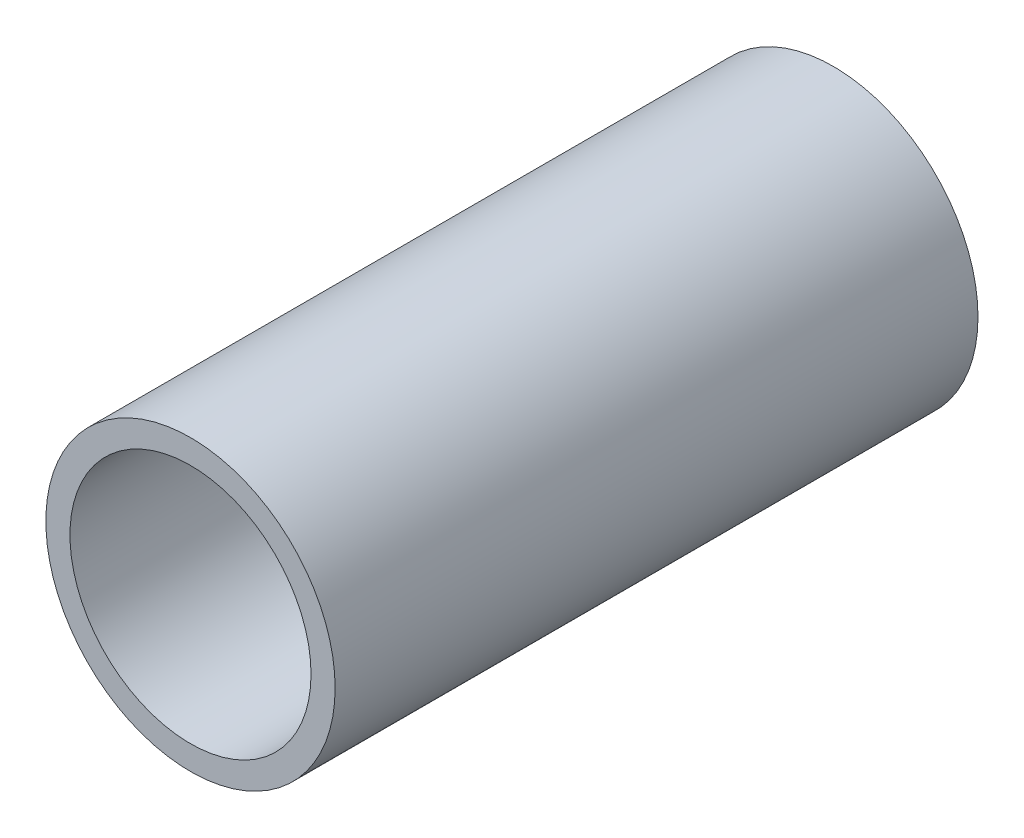
ISO-10303-21;
HEADER;
FILE_DESCRIPTION(('STEP AP214'),'2;1');
FILE_NAME('part.step','',(''),(''),'','','');
FILE_SCHEMA(('AUTOMOTIVE_DESIGN { 1 0 10303 214 1 1 1 1 }'));
ENDSEC;
DATA;
#1=APPLICATION_CONTEXT('core data for automotive mechanical design processes');
#2=APPLICATION_PROTOCOL_DEFINITION('international standard','automotive_design',2000,#1);
#3=PRODUCT_CONTEXT('',#1,'mechanical');
#4=PRODUCT('Part','Part','',(#3));
#5=PRODUCT_RELATED_PRODUCT_CATEGORY('part','',(#4));
#6=PRODUCT_DEFINITION_FORMATION('','',#4);
#7=PRODUCT_DEFINITION_CONTEXT('part definition',#1,'design');
#8=PRODUCT_DEFINITION('design','',#6,#7);
#9=PRODUCT_DEFINITION_SHAPE('','',#8);
#10=(LENGTH_UNIT() NAMED_UNIT(*) SI_UNIT(.MILLI.,.METRE.));
#11=(NAMED_UNIT(*) PLANE_ANGLE_UNIT() SI_UNIT($,.RADIAN.));
#12=(NAMED_UNIT(*) SI_UNIT($,.STERADIAN.) SOLID_ANGLE_UNIT());
#13=UNCERTAINTY_MEASURE_WITH_UNIT(LENGTH_MEASURE(1.E-05),#10,'distance_accuracy_value','');
#14=(GEOMETRIC_REPRESENTATION_CONTEXT(3) GLOBAL_UNCERTAINTY_ASSIGNED_CONTEXT((#13)) GLOBAL_UNIT_ASSIGNED_CONTEXT((#10,
#11,#12)) REPRESENTATION_CONTEXT('',''));
#15=CARTESIAN_POINT('',(0.,0.,0.));
#16=DIRECTION('',(0.,0.,1.));
#17=DIRECTION('',(1.,0.,0.));
#18=AXIS2_PLACEMENT_3D('',#15,#16,#17);
#19=CARTESIAN_POINT('',(0.,0.,40.));
#20=DIRECTION('',(0.,0.,1.));
#21=DIRECTION('',(1.,0.,0.));
#22=AXIS2_PLACEMENT_3D('',#19,#20,#21);
#23=PLANE('',#22);
#24=CARTESIAN_POINT('',(0.,0.,40.));
#25=DIRECTION('',(0.,0.,1.));
#26=DIRECTION('',(1.,0.,0.));
#27=AXIS2_PLACEMENT_3D('',#24,#25,#26);
#28=CIRCLE('',#27,9.);
#29=CARTESIAN_POINT('',(9.,0.,40.));
#30=VERTEX_POINT('',#29);
#31=EDGE_CURVE('E10',#30,#30,#28,.T.);
#32=ORIENTED_EDGE('',*,*,#31,.T.);
#33=EDGE_LOOP('',(#32));
#34=FACE_BOUND('',#33,.T.);
#35=CARTESIAN_POINT('',(0.,0.,40.));
#36=DIRECTION('',(0.,0.,1.));
#37=DIRECTION('',(1.,0.,0.));
#38=AXIS2_PLACEMENT_3D('',#35,#36,#37);
#39=CIRCLE('',#38,7.5);
#40=CARTESIAN_POINT('',(7.5,0.,40.));
#41=VERTEX_POINT('',#40);
#42=EDGE_CURVE('E44',#41,#41,#39,.T.);
#43=ORIENTED_EDGE('',*,*,#42,.F.);
#44=EDGE_LOOP('',(#43));
#45=FACE_BOUND('',#44,.T.);
#46=ADVANCED_FACE('F33',(#34,#45),#23,.T.);
#47=CARTESIAN_POINT('',(0.,0.,0.));
#48=DIRECTION('',(0.,0.,1.));
#49=DIRECTION('',(1.,0.,0.));
#50=AXIS2_PLACEMENT_3D('',#47,#48,#49);
#51=PLANE('',#50);
#52=CARTESIAN_POINT('',(0.,0.,0.));
#53=DIRECTION('',(0.,0.,1.));
#54=DIRECTION('',(1.,0.,0.));
#55=AXIS2_PLACEMENT_3D('',#52,#53,#54);
#56=CIRCLE('',#55,9.);
#57=CARTESIAN_POINT('',(9.,0.,0.));
#58=VERTEX_POINT('',#57);
#59=EDGE_CURVE('E37',#58,#58,#56,.T.);
#60=ORIENTED_EDGE('',*,*,#59,.F.);
#61=EDGE_LOOP('',(#60));
#62=FACE_BOUND('',#61,.T.);
#63=CARTESIAN_POINT('',(0.,0.,0.));
#64=DIRECTION('',(0.,0.,1.));
#65=DIRECTION('',(1.,0.,0.));
#66=AXIS2_PLACEMENT_3D('',#63,#64,#65);
#67=CIRCLE('',#66,7.5);
#68=CARTESIAN_POINT('',(7.5,0.,0.));
#69=VERTEX_POINT('',#68);
#70=EDGE_CURVE('E46',#69,#69,#67,.T.);
#71=ORIENTED_EDGE('',*,*,#70,.T.);
#72=EDGE_LOOP('',(#71));
#73=FACE_BOUND('',#72,.T.);
#74=ADVANCED_FACE('F56',(#62,#73),#51,.F.);
#75=CARTESIAN_POINT('',(0.,0.,40.));
#76=DIRECTION('',(0.,0.,-1.));
#77=DIRECTION('',(-1.,0.,0.));
#78=AXIS2_PLACEMENT_3D('',#75,#76,#77);
#79=CYLINDRICAL_SURFACE('',#78,9.);
#80=ORIENTED_EDGE('',*,*,#31,.F.);
#81=EDGE_LOOP('',(#80));
#82=FACE_BOUND('',#81,.T.);
#83=ORIENTED_EDGE('',*,*,#59,.T.);
#84=EDGE_LOOP('',(#83));
#85=FACE_BOUND('',#84,.T.);
#86=ADVANCED_FACE('F35',(#82,#85),#79,.T.);
#87=CARTESIAN_POINT('',(0.,0.,40.));
#88=DIRECTION('',(0.,0.,-1.));
#89=DIRECTION('',(-1.,0.,0.));
#90=AXIS2_PLACEMENT_3D('',#87,#88,#89);
#91=CYLINDRICAL_SURFACE('',#90,7.5);
#92=ORIENTED_EDGE('',*,*,#42,.T.);
#93=EDGE_LOOP('',(#92));
#94=FACE_BOUND('',#93,.T.);
#95=ORIENTED_EDGE('',*,*,#70,.F.);
#96=EDGE_LOOP('',(#95));
#97=FACE_BOUND('',#96,.T.);
#98=ADVANCED_FACE('F52',(#94,#97),#91,.F.);
#99=CLOSED_SHELL('',(#46,#74,#86,#98));
#100=MANIFOLD_SOLID_BREP('B2',#99);
#101=ADVANCED_BREP_SHAPE_REPRESENTATION('',(#18,#100),#14);
#102=SHAPE_DEFINITION_REPRESENTATION(#9,#101);
ENDSEC;
END-ISO-10303-21;
